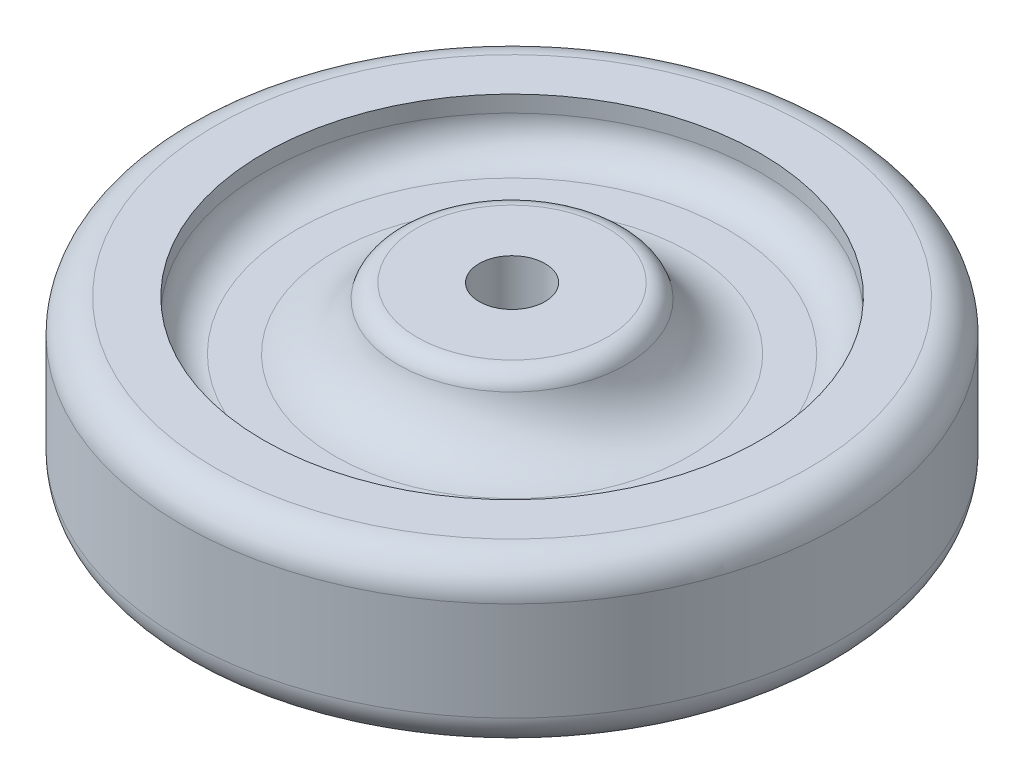
ISO-10303-21;
HEADER;
FILE_DESCRIPTION(('STEP AP214'),'2;1');
FILE_NAME('part.step','',(''),(''),'','','');
FILE_SCHEMA(('AUTOMOTIVE_DESIGN { 1 0 10303 214 1 1 1 1 }'));
ENDSEC;
DATA;
#1=APPLICATION_CONTEXT('core data for automotive mechanical design processes');
#2=APPLICATION_PROTOCOL_DEFINITION('international standard','automotive_design',2000,#1);
#3=PRODUCT_CONTEXT('',#1,'mechanical');
#4=PRODUCT('Part','Part','',(#3));
#5=PRODUCT_RELATED_PRODUCT_CATEGORY('part','',(#4));
#6=PRODUCT_DEFINITION_FORMATION('','',#4);
#7=PRODUCT_DEFINITION_CONTEXT('part definition',#1,'design');
#8=PRODUCT_DEFINITION('design','',#6,#7);
#9=PRODUCT_DEFINITION_SHAPE('','',#8);
#10=(LENGTH_UNIT() NAMED_UNIT(*) SI_UNIT(.MILLI.,.METRE.));
#11=(NAMED_UNIT(*) PLANE_ANGLE_UNIT() SI_UNIT($,.RADIAN.));
#12=(NAMED_UNIT(*) SI_UNIT($,.STERADIAN.) SOLID_ANGLE_UNIT());
#13=UNCERTAINTY_MEASURE_WITH_UNIT(LENGTH_MEASURE(1.E-05),#10,'distance_accuracy_value','');
#14=(GEOMETRIC_REPRESENTATION_CONTEXT(3) GLOBAL_UNCERTAINTY_ASSIGNED_CONTEXT((#13)) GLOBAL_UNIT_ASSIGNED_CONTEXT((#10,
#11,#12)) REPRESENTATION_CONTEXT('',''));
#15=CARTESIAN_POINT('',(0.,0.,0.));
#16=DIRECTION('',(0.,0.,1.));
#17=DIRECTION('',(1.,0.,0.));
#18=AXIS2_PLACEMENT_3D('',#15,#16,#17);
#19=CARTESIAN_POINT('',(0.,-15.875,0.));
#20=DIRECTION('',(0.,1.,0.));
#21=DIRECTION('',(0.,0.,1.));
#22=AXIS2_PLACEMENT_3D('',#19,#20,#21);
#23=CYLINDRICAL_SURFACE('',#22,47.8644717962565);
#24=CARTESIAN_POINT('',(0.,-12.7,0.));
#25=DIRECTION('',(0.,1.,0.));
#26=DIRECTION('',(0.,0.,1.));
#27=AXIS2_PLACEMENT_3D('',#24,#25,#26);
#28=CIRCLE('',#27,47.8644717962565);
#29=CARTESIAN_POINT('',(0.,-12.7,47.8644717962565));
#30=VERTEX_POINT('',#29);
#31=EDGE_CURVE('E56',#30,#30,#28,.T.);
#32=ORIENTED_EDGE('',*,*,#31,.T.);
#33=EDGE_LOOP('',(#32));
#34=FACE_BOUND('',#33,.T.);
#35=CARTESIAN_POINT('',(0.,-15.875,0.));
#36=DIRECTION('',(0.,1.,0.));
#37=DIRECTION('',(0.,0.,1.));
#38=AXIS2_PLACEMENT_3D('',#35,#36,#37);
#39=CIRCLE('',#38,47.8644717962565);
#40=CARTESIAN_POINT('',(0.,-15.875,47.8644717962565));
#41=VERTEX_POINT('',#40);
#42=EDGE_CURVE('E86',#41,#41,#39,.T.);
#43=ORIENTED_EDGE('',*,*,#42,.F.);
#44=EDGE_LOOP('',(#43));
#45=FACE_BOUND('',#44,.T.);
#46=ADVANCED_FACE('F36',(#34,#45),#23,.F.);
#47=CARTESIAN_POINT('',(0.,12.7,0.));
#48=DIRECTION('',(0.,1.,0.));
#49=DIRECTION('',(0.,0.,1.));
#50=AXIS2_PLACEMENT_3D('',#47,#48,#49);
#51=CIRCLE('',#50,47.8644717962565);
#52=CARTESIAN_POINT('',(0.,12.7,47.8644717962565));
#53=VERTEX_POINT('',#52);
#54=EDGE_CURVE('E59',#53,#53,#51,.F.);
#55=ORIENTED_EDGE('',*,*,#54,.T.);
#56=EDGE_LOOP('',(#55));
#57=FACE_BOUND('',#56,.T.);
#58=CARTESIAN_POINT('',(0.,15.875,0.));
#59=DIRECTION('',(0.,1.,0.));
#60=DIRECTION('',(0.,0.,1.));
#61=AXIS2_PLACEMENT_3D('',#58,#59,#60);
#62=CIRCLE('',#61,47.8644717962565);
#63=CARTESIAN_POINT('',(0.,15.875,47.8644717962565));
#64=VERTEX_POINT('',#63);
#65=EDGE_CURVE('E89',#64,#64,#62,.T.);
#66=ORIENTED_EDGE('',*,*,#65,.T.);
#67=EDGE_LOOP('',(#66));
#68=FACE_BOUND('',#67,.T.);
#69=ADVANCED_FACE('F116',(#57,#68),#23,.F.);
#70=CARTESIAN_POINT('',(0.,-15.875,0.));
#71=DIRECTION('',(0.,1.,0.));
#72=DIRECTION('',(0.,0.,1.));
#73=AXIS2_PLACEMENT_3D('',#70,#71,#72);
#74=CYLINDRICAL_SURFACE('',#73,63.5);
#75=CARTESIAN_POINT('',(0.,9.525,0.));
#76=DIRECTION('',(0.,1.,0.));
#77=DIRECTION('',(0.,0.,1.));
#78=AXIS2_PLACEMENT_3D('',#75,#76,#77);
#79=CIRCLE('',#78,63.5);
#80=CARTESIAN_POINT('',(0.,9.525,63.5));
#81=VERTEX_POINT('',#80);
#82=EDGE_CURVE('E77',#81,#81,#79,.F.);
#83=ORIENTED_EDGE('',*,*,#82,.T.);
#84=EDGE_LOOP('',(#83));
#85=FACE_BOUND('',#84,.T.);
#86=CARTESIAN_POINT('',(0.,-9.525,0.));
#87=DIRECTION('',(0.,1.,0.));
#88=DIRECTION('',(0.,0.,1.));
#89=AXIS2_PLACEMENT_3D('',#86,#87,#88);
#90=CIRCLE('',#89,63.5);
#91=CARTESIAN_POINT('',(0.,-9.525,63.5));
#92=VERTEX_POINT('',#91);
#93=EDGE_CURVE('E80',#92,#92,#90,.T.);
#94=ORIENTED_EDGE('',*,*,#93,.T.);
#95=EDGE_LOOP('',(#94));
#96=FACE_BOUND('',#95,.T.);
#97=ADVANCED_FACE('F122',(#85,#96),#74,.T.);
#98=CARTESIAN_POINT('',(0.,-15.875,0.));
#99=DIRECTION('',(0.,1.,0.));
#100=DIRECTION('',(0.,0.,1.));
#101=AXIS2_PLACEMENT_3D('',#98,#99,#100);
#102=PLANE('',#101);
#103=CARTESIAN_POINT('',(0.,-15.875,0.));
#104=DIRECTION('',(0.,1.,0.));
#105=DIRECTION('',(0.,0.,1.));
#106=AXIS2_PLACEMENT_3D('',#103,#104,#105);
#107=CIRCLE('',#106,57.15);
#108=CARTESIAN_POINT('',(0.,-15.875,57.15));
#109=VERTEX_POINT('',#108);
#110=EDGE_CURVE('E74',#109,#109,#107,.F.);
#111=ORIENTED_EDGE('',*,*,#110,.T.);
#112=EDGE_LOOP('',(#111));
#113=FACE_BOUND('',#112,.T.);
#114=ORIENTED_EDGE('',*,*,#42,.T.);
#115=EDGE_LOOP('',(#114));
#116=FACE_BOUND('',#115,.T.);
#117=ADVANCED_FACE('F176',(#113,#116),#102,.F.);
#118=CARTESIAN_POINT('',(0.,15.875,0.));
#119=DIRECTION('',(0.,1.,0.));
#120=DIRECTION('',(0.,0.,1.));
#121=AXIS2_PLACEMENT_3D('',#118,#119,#120);
#122=PLANE('',#121);
#123=CARTESIAN_POINT('',(0.,15.875,0.));
#124=DIRECTION('',(0.,1.,0.));
#125=DIRECTION('',(0.,0.,1.));
#126=AXIS2_PLACEMENT_3D('',#123,#124,#125);
#127=CIRCLE('',#126,57.15);
#128=CARTESIAN_POINT('',(0.,15.875,57.15));
#129=VERTEX_POINT('',#128);
#130=EDGE_CURVE('E83',#129,#129,#127,.T.);
#131=ORIENTED_EDGE('',*,*,#130,.T.);
#132=EDGE_LOOP('',(#131));
#133=FACE_BOUND('',#132,.T.);
#134=ORIENTED_EDGE('',*,*,#65,.F.);
#135=EDGE_LOOP('',(#134));
#136=FACE_BOUND('',#135,.T.);
#137=ADVANCED_FACE('F171',(#133,#136),#122,.T.);
#138=CARTESIAN_POINT('',(0.,-6.35,0.));
#139=DIRECTION('',(0.,1.,0.));
#140=DIRECTION('',(0.,0.,1.));
#141=AXIS2_PLACEMENT_3D('',#138,#139,#140);
#142=PLANE('',#141);
#143=CARTESIAN_POINT('',(0.,-6.35,0.));
#144=DIRECTION('',(0.,1.,0.));
#145=DIRECTION('',(0.,0.,1.));
#146=AXIS2_PLACEMENT_3D('',#143,#144,#145);
#147=CIRCLE('',#146,34.1445972107215);
#148=CARTESIAN_POINT('',(0.,-6.35,34.1445972107215));
#149=VERTEX_POINT('',#148);
#150=EDGE_CURVE('E62',#149,#149,#147,.T.);
#151=ORIENTED_EDGE('',*,*,#150,.T.);
#152=EDGE_LOOP('',(#151));
#153=FACE_BOUND('',#152,.T.);
#154=CARTESIAN_POINT('',(0.,-6.35,0.));
#155=DIRECTION('',(0.,1.,0.));
#156=DIRECTION('',(0.,0.,1.));
#157=AXIS2_PLACEMENT_3D('',#154,#155,#156);
#158=CIRCLE('',#157,41.5144717962565);
#159=CARTESIAN_POINT('',(0.,-6.35,41.5144717962565));
#160=VERTEX_POINT('',#159);
#161=EDGE_CURVE('E65',#160,#160,#158,.F.);
#162=ORIENTED_EDGE('',*,*,#161,.T.);
#163=EDGE_LOOP('',(#162));
#164=FACE_BOUND('',#163,.T.);
#165=ADVANCED_FACE('F161',(#153,#164),#142,.F.);
#166=CARTESIAN_POINT('',(0.,6.35,0.));
#167=DIRECTION('',(0.,1.,0.));
#168=DIRECTION('',(0.,0.,1.));
#169=AXIS2_PLACEMENT_3D('',#166,#167,#168);
#170=PLANE('',#169);
#171=CARTESIAN_POINT('',(0.,6.35,0.));
#172=DIRECTION('',(0.,1.,0.));
#173=DIRECTION('',(0.,0.,1.));
#174=AXIS2_PLACEMENT_3D('',#171,#172,#173);
#175=CIRCLE('',#174,34.1445972107215);
#176=CARTESIAN_POINT('',(0.,6.35,34.1445972107215));
#177=VERTEX_POINT('',#176);
#178=EDGE_CURVE('E68',#177,#177,#175,.F.);
#179=ORIENTED_EDGE('',*,*,#178,.T.);
#180=EDGE_LOOP('',(#179));
#181=FACE_BOUND('',#180,.T.);
#182=CARTESIAN_POINT('',(0.,6.35,0.));
#183=DIRECTION('',(0.,1.,0.));
#184=DIRECTION('',(0.,0.,1.));
#185=AXIS2_PLACEMENT_3D('',#182,#183,#184);
#186=CIRCLE('',#185,41.5144717962565);
#187=CARTESIAN_POINT('',(0.,6.35,41.5144717962565));
#188=VERTEX_POINT('',#187);
#189=EDGE_CURVE('E71',#188,#188,#186,.T.);
#190=ORIENTED_EDGE('',*,*,#189,.T.);
#191=EDGE_LOOP('',(#190));
#192=FACE_BOUND('',#191,.T.);
#193=ADVANCED_FACE('F158',(#181,#192),#170,.T.);
#194=CARTESIAN_POINT('',(0.,-18.25625,0.));
#195=DIRECTION('',(0.,1.,0.));
#196=DIRECTION('',(0.,0.,1.));
#197=AXIS2_PLACEMENT_3D('',#194,#195,#196);
#198=CYLINDRICAL_SURFACE('',#197,6.35);
#199=CARTESIAN_POINT('',(0.,-18.25625,0.));
#200=DIRECTION('',(0.,1.,0.));
#201=DIRECTION('',(0.,0.,1.));
#202=AXIS2_PLACEMENT_3D('',#199,#200,#201);
#203=CIRCLE('',#202,6.35);
#204=CARTESIAN_POINT('',(0.,-18.25625,6.35));
#205=VERTEX_POINT('',#204);
#206=EDGE_CURVE('E92',#205,#205,#203,.T.);
#207=ORIENTED_EDGE('',*,*,#206,.F.);
#208=EDGE_LOOP('',(#207));
#209=FACE_BOUND('',#208,.T.);
#210=CARTESIAN_POINT('',(0.,18.25625,0.));
#211=DIRECTION('',(0.,1.,0.));
#212=DIRECTION('',(0.,0.,1.));
#213=AXIS2_PLACEMENT_3D('',#210,#211,#212);
#214=CIRCLE('',#213,6.35);
#215=CARTESIAN_POINT('',(0.,18.25625,6.35));
#216=VERTEX_POINT('',#215);
#217=EDGE_CURVE('E95',#216,#216,#214,.T.);
#218=ORIENTED_EDGE('',*,*,#217,.T.);
#219=EDGE_LOOP('',(#218));
#220=FACE_BOUND('',#219,.T.);
#221=ADVANCED_FACE('F99',(#209,#220),#198,.F.);
#222=CARTESIAN_POINT('',(0.,-18.25625,0.));
#223=DIRECTION('',(0.,1.,0.));
#224=DIRECTION('',(0.,0.,1.));
#225=AXIS2_PLACEMENT_3D('',#222,#223,#224);
#226=PLANE('',#225);
#227=CARTESIAN_POINT('',(0.,-18.25625,0.));
#228=DIRECTION('',(0.,1.,0.));
#229=DIRECTION('',(0.,0.,1.));
#230=AXIS2_PLACEMENT_3D('',#227,#228,#229);
#231=CIRCLE('',#230,18.2894533785925);
#232=CARTESIAN_POINT('',(0.,-18.25625,18.2894533785925));
#233=VERTEX_POINT('',#232);
#234=EDGE_CURVE('E11',#233,#233,#231,.F.);
#235=ORIENTED_EDGE('',*,*,#234,.T.);
#236=EDGE_LOOP('',(#235));
#237=FACE_BOUND('',#236,.T.);
#238=ORIENTED_EDGE('',*,*,#206,.T.);
#239=EDGE_LOOP('',(#238));
#240=FACE_BOUND('',#239,.T.);
#241=ADVANCED_FACE('F104',(#237,#240),#226,.F.);
#242=CARTESIAN_POINT('',(0.,18.25625,0.));
#243=DIRECTION('',(0.,1.,0.));
#244=DIRECTION('',(0.,0.,1.));
#245=AXIS2_PLACEMENT_3D('',#242,#243,#244);
#246=PLANE('',#245);
#247=CARTESIAN_POINT('',(0.,18.25625,0.));
#248=DIRECTION('',(0.,1.,0.));
#249=DIRECTION('',(0.,0.,1.));
#250=AXIS2_PLACEMENT_3D('',#247,#248,#249);
#251=CIRCLE('',#250,18.2894533785925);
#252=CARTESIAN_POINT('',(0.,18.25625,18.2894533785925));
#253=VERTEX_POINT('',#252);
#254=EDGE_CURVE('E51',#253,#253,#251,.T.);
#255=ORIENTED_EDGE('',*,*,#254,.T.);
#256=EDGE_LOOP('',(#255));
#257=FACE_BOUND('',#256,.T.);
#258=ORIENTED_EDGE('',*,*,#217,.F.);
#259=EDGE_LOOP('',(#258));
#260=FACE_BOUND('',#259,.T.);
#261=ADVANCED_FACE('F101',(#257,#260),#246,.T.);
#262=CARTESIAN_POINT('',(0.,9.525,0.));
#263=DIRECTION('',(0.,1.,0.));
#264=DIRECTION('',(0.,0.,1.));
#265=AXIS2_PLACEMENT_3D('',#262,#263,#264);
#266=TOROIDAL_SURFACE('',#265,57.15,6.35);
#267=ORIENTED_EDGE('',*,*,#82,.F.);
#268=EDGE_LOOP('',(#267));
#269=FACE_BOUND('',#268,.T.);
#270=ORIENTED_EDGE('',*,*,#130,.F.);
#271=EDGE_LOOP('',(#270));
#272=FACE_BOUND('',#271,.T.);
#273=ADVANCED_FACE('F103',(#269,#272),#266,.T.);
#274=CARTESIAN_POINT('',(0.,-9.525,0.));
#275=DIRECTION('',(0.,1.,0.));
#276=DIRECTION('',(0.,0.,1.));
#277=AXIS2_PLACEMENT_3D('',#274,#275,#276);
#278=TOROIDAL_SURFACE('',#277,57.15,6.35);
#279=ORIENTED_EDGE('',*,*,#110,.F.);
#280=EDGE_LOOP('',(#279));
#281=FACE_BOUND('',#280,.T.);
#282=ORIENTED_EDGE('',*,*,#93,.F.);
#283=EDGE_LOOP('',(#282));
#284=FACE_BOUND('',#283,.T.);
#285=ADVANCED_FACE('F111',(#281,#284),#278,.T.);
#286=CARTESIAN_POINT('',(0.,19.05,0.));
#287=DIRECTION('',(0.,1.,0.));
#288=DIRECTION('',(0.,0.,1.));
#289=AXIS2_PLACEMENT_3D('',#286,#287,#288);
#290=TOROIDAL_SURFACE('',#289,34.1445972107215,12.7);
#291=CARTESIAN_POINT('',(0.,15.5086538461538,0.));
#292=DIRECTION('',(0.,1.,0.));
#293=DIRECTION('',(0.,0.,1.));
#294=AXIS2_PLACEMENT_3D('',#291,#292,#293);
#295=CIRCLE('',#294,21.9483327244684);
#296=CARTESIAN_POINT('',(0.,15.5086538461538,21.9483327244684));
#297=VERTEX_POINT('',#296);
#298=EDGE_CURVE('E47',#297,#297,#295,.F.);
#299=ORIENTED_EDGE('',*,*,#298,.T.);
#300=EDGE_LOOP('',(#299));
#301=FACE_BOUND('',#300,.T.);
#302=ORIENTED_EDGE('',*,*,#178,.F.);
#303=EDGE_LOOP('',(#302));
#304=FACE_BOUND('',#303,.T.);
#305=ADVANCED_FACE('F130',(#301,#304),#290,.F.);
#306=CARTESIAN_POINT('',(0.,-19.05,0.));
#307=DIRECTION('',(0.,1.,0.));
#308=DIRECTION('',(0.,0.,1.));
#309=AXIS2_PLACEMENT_3D('',#306,#307,#308);
#310=TOROIDAL_SURFACE('',#309,34.1445972107215,12.7);
#311=CARTESIAN_POINT('',(0.,-15.5086538461538,0.));
#312=DIRECTION('',(0.,-1.,0.));
#313=DIRECTION('',(0.,0.,-1.));
#314=AXIS2_PLACEMENT_3D('',#311,#312,#313);
#315=CIRCLE('',#314,21.9483327244684);
#316=CARTESIAN_POINT('',(0.,-15.5086538461538,-21.9483327244684));
#317=VERTEX_POINT('',#316);
#318=EDGE_CURVE('E43',#317,#317,#315,.F.);
#319=ORIENTED_EDGE('',*,*,#318,.T.);
#320=EDGE_LOOP('',(#319));
#321=FACE_BOUND('',#320,.T.);
#322=ORIENTED_EDGE('',*,*,#150,.F.);
#323=EDGE_LOOP('',(#322));
#324=FACE_BOUND('',#323,.T.);
#325=ADVANCED_FACE('F134',(#321,#324),#310,.F.);
#326=CARTESIAN_POINT('',(0.,12.7,0.));
#327=DIRECTION('',(0.,1.,0.));
#328=DIRECTION('',(0.,0.,1.));
#329=AXIS2_PLACEMENT_3D('',#326,#327,#328);
#330=TOROIDAL_SURFACE('',#329,41.5144717962565,6.35);
#331=ORIENTED_EDGE('',*,*,#54,.F.);
#332=EDGE_LOOP('',(#331));
#333=FACE_BOUND('',#332,.T.);
#334=ORIENTED_EDGE('',*,*,#189,.F.);
#335=EDGE_LOOP('',(#334));
#336=FACE_BOUND('',#335,.T.);
#337=ADVANCED_FACE('F138',(#333,#336),#330,.F.);
#338=CARTESIAN_POINT('',(0.,-12.7,0.));
#339=DIRECTION('',(0.,1.,0.));
#340=DIRECTION('',(0.,0.,1.));
#341=AXIS2_PLACEMENT_3D('',#338,#339,#340);
#342=TOROIDAL_SURFACE('',#341,41.5144717962565,6.35);
#343=ORIENTED_EDGE('',*,*,#31,.F.);
#344=EDGE_LOOP('',(#343));
#345=FACE_BOUND('',#344,.T.);
#346=ORIENTED_EDGE('',*,*,#161,.F.);
#347=EDGE_LOOP('',(#346));
#348=FACE_BOUND('',#347,.T.);
#349=ADVANCED_FACE('F141',(#345,#348),#342,.F.);
#350=CARTESIAN_POINT('',(0.,14.44625,0.));
#351=DIRECTION('',(0.,-1.,0.));
#352=DIRECTION('',(0.,0.,-1.));
#353=AXIS2_PLACEMENT_3D('',#350,#351,#352);
#354=TOROIDAL_SURFACE('',#353,18.2894533785925,3.81);
#355=ORIENTED_EDGE('',*,*,#298,.F.);
#356=EDGE_LOOP('',(#355));
#357=FACE_BOUND('',#356,.T.);
#358=ORIENTED_EDGE('',*,*,#254,.F.);
#359=EDGE_LOOP('',(#358));
#360=FACE_BOUND('',#359,.T.);
#361=ADVANCED_FACE('F144',(#357,#360),#354,.T.);
#362=CARTESIAN_POINT('',(0.,-14.44625,0.));
#363=DIRECTION('',(0.,-1.,0.));
#364=DIRECTION('',(0.,0.,-1.));
#365=AXIS2_PLACEMENT_3D('',#362,#363,#364);
#366=TOROIDAL_SURFACE('',#365,18.2894533785925,3.81);
#367=ORIENTED_EDGE('',*,*,#234,.F.);
#368=EDGE_LOOP('',(#367));
#369=FACE_BOUND('',#368,.T.);
#370=ORIENTED_EDGE('',*,*,#318,.F.);
#371=EDGE_LOOP('',(#370));
#372=FACE_BOUND('',#371,.T.);
#373=ADVANCED_FACE('F38',(#369,#372),#366,.T.);
#374=CLOSED_SHELL('',(#46,#69,#97,#117,#137,#165,#193,#221,#241,#261,#273,#285,#305,#325,#337,
#349,#361,#373));
#375=MANIFOLD_SOLID_BREP('B2',#374);
#376=ADVANCED_BREP_SHAPE_REPRESENTATION('',(#18,#375),#14);
#377=SHAPE_DEFINITION_REPRESENTATION(#9,#376);
ENDSEC;
END-ISO-10303-21;
